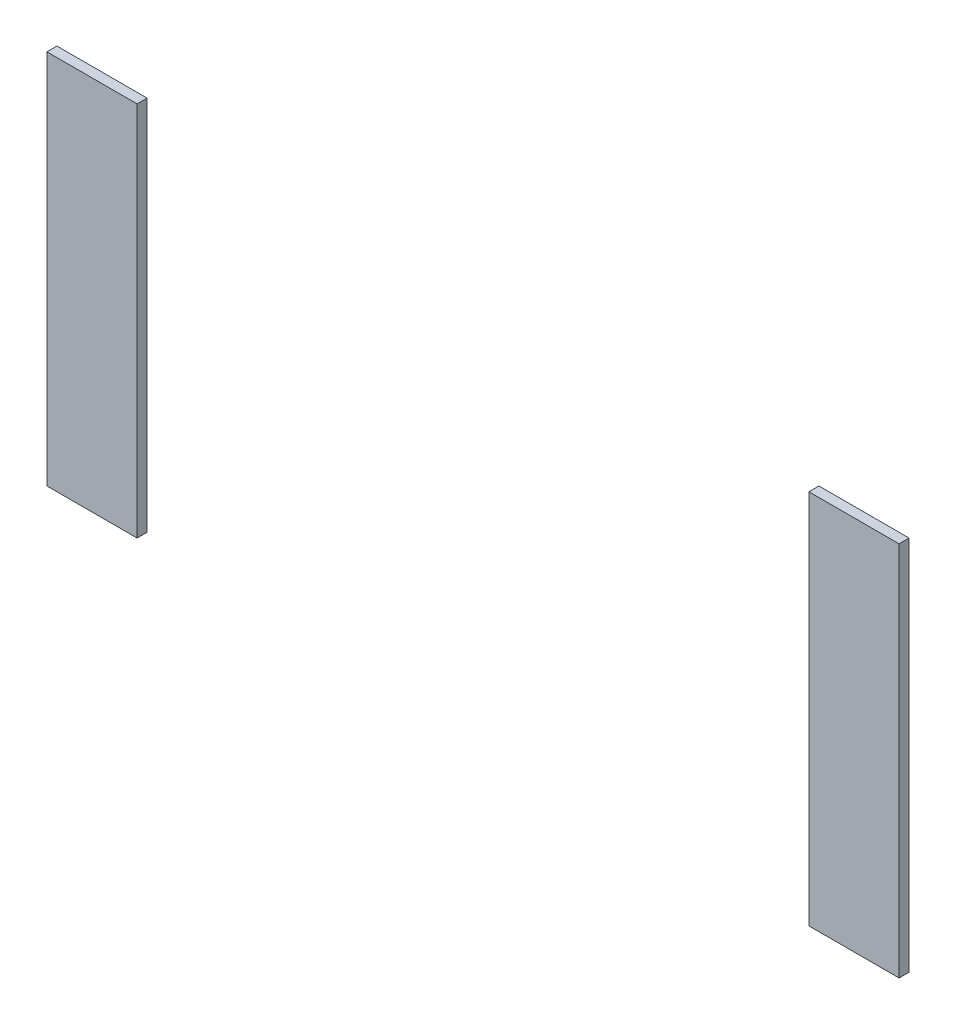
ISO-10303-21;
HEADER;
FILE_DESCRIPTION(('STEP AP214'),'2;1');
FILE_NAME('part.step','',(''),(''),'','','');
FILE_SCHEMA(('AUTOMOTIVE_DESIGN { 1 0 10303 214 1 1 1 1 }'));
ENDSEC;
DATA;
#1=APPLICATION_CONTEXT('core data for automotive mechanical design processes');
#2=APPLICATION_PROTOCOL_DEFINITION('international standard','automotive_design',2000,#1);
#3=PRODUCT_CONTEXT('',#1,'mechanical');
#4=PRODUCT('Part','Part','',(#3));
#5=PRODUCT_RELATED_PRODUCT_CATEGORY('part','',(#4));
#6=PRODUCT_DEFINITION_FORMATION('','',#4);
#7=PRODUCT_DEFINITION_CONTEXT('part definition',#1,'design');
#8=PRODUCT_DEFINITION('design','',#6,#7);
#9=PRODUCT_DEFINITION_SHAPE('','',#8);
#10=(LENGTH_UNIT() NAMED_UNIT(*) SI_UNIT(.MILLI.,.METRE.));
#11=(NAMED_UNIT(*) PLANE_ANGLE_UNIT() SI_UNIT($,.RADIAN.));
#12=(NAMED_UNIT(*) SI_UNIT($,.STERADIAN.) SOLID_ANGLE_UNIT());
#13=UNCERTAINTY_MEASURE_WITH_UNIT(LENGTH_MEASURE(1.E-05),#10,'distance_accuracy_value','');
#14=(GEOMETRIC_REPRESENTATION_CONTEXT(3) GLOBAL_UNCERTAINTY_ASSIGNED_CONTEXT((#13)) GLOBAL_UNIT_ASSIGNED_CONTEXT((#10,
#11,#12)) REPRESENTATION_CONTEXT('',''));
#15=CARTESIAN_POINT('',(0.,0.,0.));
#16=DIRECTION('',(0.,0.,1.));
#17=DIRECTION('',(1.,0.,0.));
#18=AXIS2_PLACEMENT_3D('',#15,#16,#17);
#19=CARTESIAN_POINT('',(335.000000000001,0.,10.));
#20=DIRECTION('',(-1.,0.,0.));
#21=DIRECTION('',(0.,0.,1.));
#22=AXIS2_PLACEMENT_3D('',#19,#20,#21);
#23=PLANE('',#22);
#24=DIRECTION('',(0.,1.,0.));
#25=VECTOR('',#24,1.);
#26=CARTESIAN_POINT('',(335.000000000001,0.,0.));
#27=LINE('',#26,#25);
#28=CARTESIAN_POINT('',(335.000000000001,-45.,0.));
#29=VERTEX_POINT('',#28);
#30=CARTESIAN_POINT('',(335.000000000001,330.,0.));
#31=VERTEX_POINT('',#30);
#32=EDGE_CURVE('E109',#29,#31,#27,.T.);
#33=ORIENTED_EDGE('',*,*,#32,.F.);
#34=DIRECTION('',(0.,0.,-1.));
#35=VECTOR('',#34,1.);
#36=CARTESIAN_POINT('',(335.000000000001,-45.,10.));
#37=LINE('',#36,#35);
#38=CARTESIAN_POINT('',(335.000000000001,-45.,10.));
#39=VERTEX_POINT('',#38);
#40=EDGE_CURVE('E12',#39,#29,#37,.T.);
#41=ORIENTED_EDGE('',*,*,#40,.F.);
#42=DIRECTION('',(0.,1.,0.));
#43=VECTOR('',#42,1.);
#44=CARTESIAN_POINT('',(335.000000000001,0.,10.));
#45=LINE('',#44,#43);
#46=CARTESIAN_POINT('',(335.000000000001,330.,10.));
#47=VERTEX_POINT('',#46);
#48=EDGE_CURVE('E103',#39,#47,#45,.T.);
#49=ORIENTED_EDGE('',*,*,#48,.T.);
#50=DIRECTION('',(0.,0.,-1.));
#51=VECTOR('',#50,1.);
#52=CARTESIAN_POINT('',(335.000000000001,330.,10.));
#53=LINE('',#52,#51);
#54=EDGE_CURVE('E61',#47,#31,#53,.T.);
#55=ORIENTED_EDGE('',*,*,#54,.T.);
#56=EDGE_LOOP('',(#33,#41,#49,#55));
#57=FACE_BOUND('',#56,.T.);
#58=ADVANCED_FACE('F45',(#57),#23,.T.);
#59=CARTESIAN_POINT('',(0.,-45.0000000000001,10.));
#60=DIRECTION('',(0.,-1.,0.));
#61=DIRECTION('',(1.,0.,0.));
#62=AXIS2_PLACEMENT_3D('',#59,#60,#61);
#63=PLANE('',#62);
#64=DIRECTION('',(-1.,0.,0.));
#65=VECTOR('',#64,1.);
#66=CARTESIAN_POINT('',(0.,-45.0000000000001,0.));
#67=LINE('',#66,#65);
#68=CARTESIAN_POINT('',(425.000000000001,-45.,0.));
#69=VERTEX_POINT('',#68);
#70=EDGE_CURVE('E93',#69,#29,#67,.T.);
#71=ORIENTED_EDGE('',*,*,#70,.F.);
#72=DIRECTION('',(0.,0.,-1.));
#73=VECTOR('',#72,1.);
#74=CARTESIAN_POINT('',(425.000000000001,-45.,10.));
#75=LINE('',#74,#73);
#76=CARTESIAN_POINT('',(425.000000000001,-45.,10.));
#77=VERTEX_POINT('',#76);
#78=EDGE_CURVE('E53',#77,#69,#75,.T.);
#79=ORIENTED_EDGE('',*,*,#78,.F.);
#80=DIRECTION('',(-1.,0.,0.));
#81=VECTOR('',#80,1.);
#82=CARTESIAN_POINT('',(0.,-45.0000000000001,10.));
#83=LINE('',#82,#81);
#84=EDGE_CURVE('E91',#77,#39,#83,.T.);
#85=ORIENTED_EDGE('',*,*,#84,.T.);
#86=ORIENTED_EDGE('',*,*,#40,.T.);
#87=EDGE_LOOP('',(#71,#79,#85,#86));
#88=FACE_BOUND('',#87,.T.);
#89=ADVANCED_FACE('F89',(#88),#63,.T.);
#90=CARTESIAN_POINT('',(425.000000000001,0.,10.));
#91=DIRECTION('',(-1.,0.,0.));
#92=DIRECTION('',(0.,0.,1.));
#93=AXIS2_PLACEMENT_3D('',#90,#91,#92);
#94=PLANE('',#93);
#95=DIRECTION('',(0.,1.,0.));
#96=VECTOR('',#95,1.);
#97=CARTESIAN_POINT('',(425.000000000001,0.,0.));
#98=LINE('',#97,#96);
#99=CARTESIAN_POINT('',(425.000000000001,330.,0.));
#100=VERTEX_POINT('',#99);
#101=EDGE_CURVE('E112',#69,#100,#98,.T.);
#102=ORIENTED_EDGE('',*,*,#101,.T.);
#103=DIRECTION('',(0.,0.,-1.));
#104=VECTOR('',#103,1.);
#105=CARTESIAN_POINT('',(425.000000000001,330.,10.));
#106=LINE('',#105,#104);
#107=CARTESIAN_POINT('',(425.000000000001,330.,10.));
#108=VERTEX_POINT('',#107);
#109=EDGE_CURVE('E75',#108,#100,#106,.T.);
#110=ORIENTED_EDGE('',*,*,#109,.F.);
#111=DIRECTION('',(0.,1.,0.));
#112=VECTOR('',#111,1.);
#113=CARTESIAN_POINT('',(425.000000000001,0.,10.));
#114=LINE('',#113,#112);
#115=EDGE_CURVE('E96',#77,#108,#114,.T.);
#116=ORIENTED_EDGE('',*,*,#115,.F.);
#117=ORIENTED_EDGE('',*,*,#78,.T.);
#118=EDGE_LOOP('',(#102,#110,#116,#117));
#119=FACE_BOUND('',#118,.T.);
#120=ADVANCED_FACE('F97',(#119),#94,.F.);
#121=CARTESIAN_POINT('',(0.,330.,10.));
#122=DIRECTION('',(0.,1.,0.));
#123=DIRECTION('',(0.,0.,1.));
#124=AXIS2_PLACEMENT_3D('',#121,#122,#123);
#125=PLANE('',#124);
#126=DIRECTION('',(1.,0.,0.));
#127=VECTOR('',#126,1.);
#128=CARTESIAN_POINT('',(0.,330.,0.));
#129=LINE('',#128,#127);
#130=EDGE_CURVE('E105',#31,#100,#129,.T.);
#131=ORIENTED_EDGE('',*,*,#130,.F.);
#132=ORIENTED_EDGE('',*,*,#54,.F.);
#133=DIRECTION('',(1.,0.,0.));
#134=VECTOR('',#133,1.);
#135=CARTESIAN_POINT('',(0.,330.,10.));
#136=LINE('',#135,#134);
#137=EDGE_CURVE('E100',#47,#108,#136,.T.);
#138=ORIENTED_EDGE('',*,*,#137,.T.);
#139=ORIENTED_EDGE('',*,*,#109,.T.);
#140=EDGE_LOOP('',(#131,#132,#138,#139));
#141=FACE_BOUND('',#140,.T.);
#142=ADVANCED_FACE('F119',(#141),#125,.T.);
#143=CARTESIAN_POINT('',(0.,0.,10.));
#144=DIRECTION('',(0.,0.,1.));
#145=DIRECTION('',(1.,0.,0.));
#146=AXIS2_PLACEMENT_3D('',#143,#144,#145);
#147=PLANE('',#146);
#148=ORIENTED_EDGE('',*,*,#48,.F.);
#149=ORIENTED_EDGE('',*,*,#84,.F.);
#150=ORIENTED_EDGE('',*,*,#115,.T.);
#151=ORIENTED_EDGE('',*,*,#137,.F.);
#152=EDGE_LOOP('',(#148,#149,#150,#151));
#153=FACE_BOUND('',#152,.T.);
#154=ADVANCED_FACE('F102',(#153),#147,.T.);
#155=CARTESIAN_POINT('',(0.,0.,0.));
#156=DIRECTION('',(0.,0.,1.));
#157=DIRECTION('',(1.,0.,0.));
#158=AXIS2_PLACEMENT_3D('',#155,#156,#157);
#159=PLANE('',#158);
#160=ORIENTED_EDGE('',*,*,#32,.T.);
#161=ORIENTED_EDGE('',*,*,#130,.T.);
#162=ORIENTED_EDGE('',*,*,#101,.F.);
#163=ORIENTED_EDGE('',*,*,#70,.T.);
#164=EDGE_LOOP('',(#160,#161,#162,#163));
#165=FACE_BOUND('',#164,.T.);
#166=ADVANCED_FACE('F118',(#165),#159,.F.);
#167=CLOSED_SHELL('',(#58,#89,#120,#142,#154,#166));
#168=MANIFOLD_SOLID_BREP('B2',#167);
#169=CARTESIAN_POINT('',(0.,-45.,10.));
#170=DIRECTION('',(0.,1.,0.));
#171=DIRECTION('',(0.,0.,1.));
#172=AXIS2_PLACEMENT_3D('',#169,#170,#171);
#173=PLANE('',#172);
#174=DIRECTION('',(1.,0.,0.));
#175=VECTOR('',#174,1.);
#176=CARTESIAN_POINT('',(0.,-45.,0.));
#177=LINE('',#176,#175);
#178=CARTESIAN_POINT('',(-424.999999999999,-45.,0.));
#179=VERTEX_POINT('',#178);
#180=CARTESIAN_POINT('',(-334.999999999999,-45.,0.));
#181=VERTEX_POINT('',#180);
#182=EDGE_CURVE('E235',#179,#181,#177,.T.);
#183=ORIENTED_EDGE('',*,*,#182,.T.);
#184=DIRECTION('',(0.,0.,-1.));
#185=VECTOR('',#184,1.);
#186=CARTESIAN_POINT('',(-334.999999999999,-45.,10.));
#187=LINE('',#186,#185);
#188=CARTESIAN_POINT('',(-334.999999999999,-45.,10.));
#189=VERTEX_POINT('',#188);
#190=EDGE_CURVE('E43',#189,#181,#187,.T.);
#191=ORIENTED_EDGE('',*,*,#190,.F.);
#192=DIRECTION('',(1.,0.,0.));
#193=VECTOR('',#192,1.);
#194=CARTESIAN_POINT('',(0.,-45.,10.));
#195=LINE('',#194,#193);
#196=CARTESIAN_POINT('',(-424.999999999999,-45.,10.));
#197=VERTEX_POINT('',#196);
#198=EDGE_CURVE('E221',#197,#189,#195,.T.);
#199=ORIENTED_EDGE('',*,*,#198,.F.);
#200=DIRECTION('',(0.,0.,-1.));
#201=VECTOR('',#200,1.);
#202=CARTESIAN_POINT('',(-424.999999999999,-45.,10.));
#203=LINE('',#202,#201);
#204=EDGE_CURVE('E188',#197,#179,#203,.T.);
#205=ORIENTED_EDGE('',*,*,#204,.T.);
#206=EDGE_LOOP('',(#183,#191,#199,#205));
#207=FACE_BOUND('',#206,.T.);
#208=ADVANCED_FACE('F172',(#207),#173,.F.);
#209=CARTESIAN_POINT('',(-334.999999999999,0.,10.));
#210=DIRECTION('',(-1.,0.,0.));
#211=DIRECTION('',(0.,0.,1.));
#212=AXIS2_PLACEMENT_3D('',#209,#210,#211);
#213=PLANE('',#212);
#214=DIRECTION('',(0.,1.,0.));
#215=VECTOR('',#214,1.);
#216=CARTESIAN_POINT('',(-334.999999999999,0.,0.));
#217=LINE('',#216,#215);
#218=CARTESIAN_POINT('',(-334.999999999999,330.,0.));
#219=VERTEX_POINT('',#218);
#220=EDGE_CURVE('E226',#181,#219,#217,.T.);
#221=ORIENTED_EDGE('',*,*,#220,.T.);
#222=DIRECTION('',(0.,0.,-1.));
#223=VECTOR('',#222,1.);
#224=CARTESIAN_POINT('',(-334.999999999999,330.,10.));
#225=LINE('',#224,#223);
#226=CARTESIAN_POINT('',(-334.999999999999,330.,10.));
#227=VERTEX_POINT('',#226);
#228=EDGE_CURVE('E180',#227,#219,#225,.T.);
#229=ORIENTED_EDGE('',*,*,#228,.F.);
#230=DIRECTION('',(0.,1.,0.));
#231=VECTOR('',#230,1.);
#232=CARTESIAN_POINT('',(-334.999999999999,0.,10.));
#233=LINE('',#232,#231);
#234=EDGE_CURVE('E213',#189,#227,#233,.T.);
#235=ORIENTED_EDGE('',*,*,#234,.F.);
#236=ORIENTED_EDGE('',*,*,#190,.T.);
#237=EDGE_LOOP('',(#221,#229,#235,#236));
#238=FACE_BOUND('',#237,.T.);
#239=ADVANCED_FACE('F225',(#238),#213,.F.);
#240=CARTESIAN_POINT('',(0.,330.,10.));
#241=DIRECTION('',(0.,1.,0.));
#242=DIRECTION('',(0.,0.,1.));
#243=AXIS2_PLACEMENT_3D('',#240,#241,#242);
#244=PLANE('',#243);
#245=DIRECTION('',(1.,0.,0.));
#246=VECTOR('',#245,1.);
#247=CARTESIAN_POINT('',(0.,330.,0.));
#248=LINE('',#247,#246);
#249=CARTESIAN_POINT('',(-424.999999999999,330.,0.));
#250=VERTEX_POINT('',#249);
#251=EDGE_CURVE('E238',#250,#219,#248,.T.);
#252=ORIENTED_EDGE('',*,*,#251,.F.);
#253=DIRECTION('',(0.,0.,-1.));
#254=VECTOR('',#253,1.);
#255=CARTESIAN_POINT('',(-424.999999999999,330.,10.));
#256=LINE('',#255,#254);
#257=CARTESIAN_POINT('',(-424.999999999999,330.,10.));
#258=VERTEX_POINT('',#257);
#259=EDGE_CURVE('E202',#258,#250,#256,.T.);
#260=ORIENTED_EDGE('',*,*,#259,.F.);
#261=DIRECTION('',(1.,0.,0.));
#262=VECTOR('',#261,1.);
#263=CARTESIAN_POINT('',(0.,330.,10.));
#264=LINE('',#263,#262);
#265=EDGE_CURVE('E220',#258,#227,#264,.T.);
#266=ORIENTED_EDGE('',*,*,#265,.T.);
#267=ORIENTED_EDGE('',*,*,#228,.T.);
#268=EDGE_LOOP('',(#252,#260,#266,#267));
#269=FACE_BOUND('',#268,.T.);
#270=ADVANCED_FACE('F229',(#269),#244,.T.);
#271=CARTESIAN_POINT('',(-424.999999999999,0.,10.));
#272=DIRECTION('',(-1.,0.,0.));
#273=DIRECTION('',(0.,0.,1.));
#274=AXIS2_PLACEMENT_3D('',#271,#272,#273);
#275=PLANE('',#274);
#276=DIRECTION('',(0.,1.,0.));
#277=VECTOR('',#276,1.);
#278=CARTESIAN_POINT('',(-424.999999999999,0.,0.));
#279=LINE('',#278,#277);
#280=EDGE_CURVE('E240',#179,#250,#279,.T.);
#281=ORIENTED_EDGE('',*,*,#280,.F.);
#282=ORIENTED_EDGE('',*,*,#204,.F.);
#283=DIRECTION('',(0.,1.,0.));
#284=VECTOR('',#283,1.);
#285=CARTESIAN_POINT('',(-424.999999999999,0.,10.));
#286=LINE('',#285,#284);
#287=EDGE_CURVE('E230',#197,#258,#286,.T.);
#288=ORIENTED_EDGE('',*,*,#287,.T.);
#289=ORIENTED_EDGE('',*,*,#259,.T.);
#290=EDGE_LOOP('',(#281,#282,#288,#289));
#291=FACE_BOUND('',#290,.T.);
#292=ADVANCED_FACE('F246',(#291),#275,.T.);
#293=CARTESIAN_POINT('',(0.,0.,10.));
#294=DIRECTION('',(0.,0.,1.));
#295=DIRECTION('',(1.,0.,0.));
#296=AXIS2_PLACEMENT_3D('',#293,#294,#295);
#297=PLANE('',#296);
#298=ORIENTED_EDGE('',*,*,#198,.T.);
#299=ORIENTED_EDGE('',*,*,#234,.T.);
#300=ORIENTED_EDGE('',*,*,#265,.F.);
#301=ORIENTED_EDGE('',*,*,#287,.F.);
#302=EDGE_LOOP('',(#298,#299,#300,#301));
#303=FACE_BOUND('',#302,.T.);
#304=ADVANCED_FACE('F217',(#303),#297,.T.);
#305=CARTESIAN_POINT('',(0.,0.,0.));
#306=DIRECTION('',(0.,0.,1.));
#307=DIRECTION('',(1.,0.,0.));
#308=AXIS2_PLACEMENT_3D('',#305,#306,#307);
#309=PLANE('',#308);
#310=ORIENTED_EDGE('',*,*,#182,.F.);
#311=ORIENTED_EDGE('',*,*,#280,.T.);
#312=ORIENTED_EDGE('',*,*,#251,.T.);
#313=ORIENTED_EDGE('',*,*,#220,.F.);
#314=EDGE_LOOP('',(#310,#311,#312,#313));
#315=FACE_BOUND('',#314,.T.);
#316=ADVANCED_FACE('F245',(#315),#309,.F.);
#317=CLOSED_SHELL('',(#208,#239,#270,#292,#304,#316));
#318=MANIFOLD_SOLID_BREP('B6',#317);
#319=ADVANCED_BREP_SHAPE_REPRESENTATION('',(#18,#168,#318),#14);
#320=SHAPE_DEFINITION_REPRESENTATION(#9,#319);
ENDSEC;
END-ISO-10303-21;
